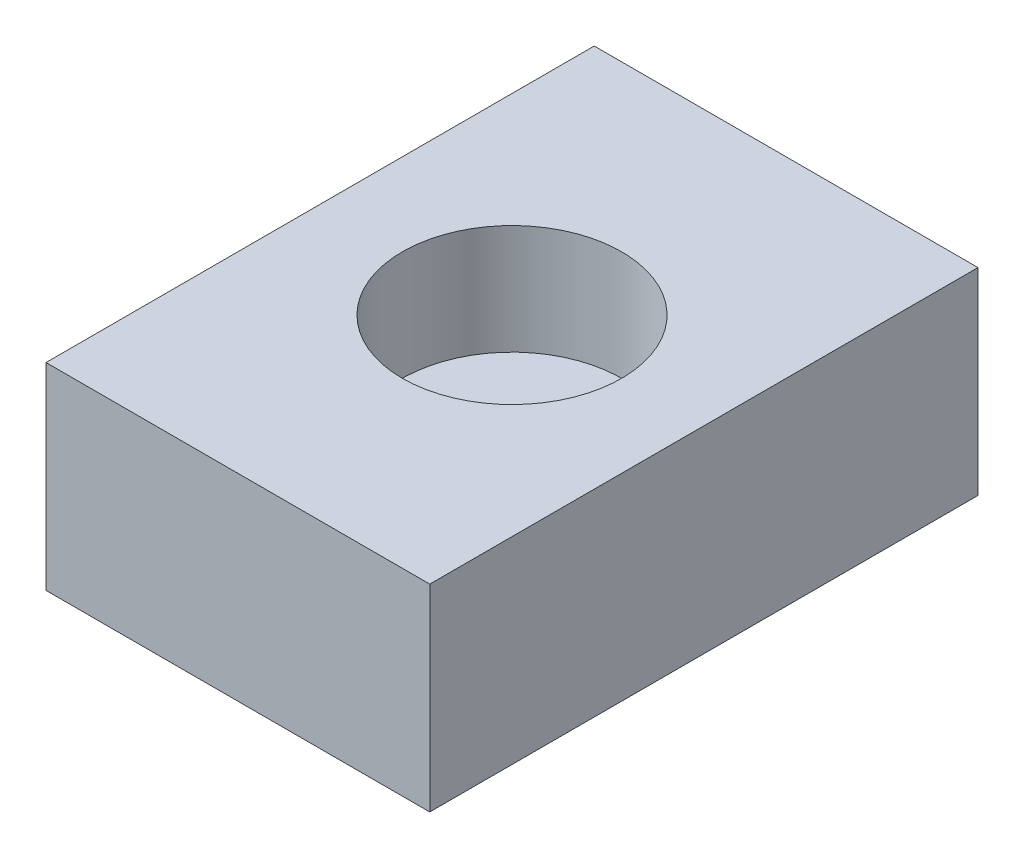
ISO-10303-21;
HEADER;
FILE_DESCRIPTION(('STEP AP214'),'2;1');
FILE_NAME('part.step','',(''),(''),'','','');
FILE_SCHEMA(('AUTOMOTIVE_DESIGN { 1 0 10303 214 1 1 1 1 }'));
ENDSEC;
DATA;
#1=APPLICATION_CONTEXT('core data for automotive mechanical design processes');
#2=APPLICATION_PROTOCOL_DEFINITION('international standard','automotive_design',2000,#1);
#3=PRODUCT_CONTEXT('',#1,'mechanical');
#4=PRODUCT('Part','Part','',(#3));
#5=PRODUCT_RELATED_PRODUCT_CATEGORY('part','',(#4));
#6=PRODUCT_DEFINITION_FORMATION('','',#4);
#7=PRODUCT_DEFINITION_CONTEXT('part definition',#1,'design');
#8=PRODUCT_DEFINITION('design','',#6,#7);
#9=PRODUCT_DEFINITION_SHAPE('','',#8);
#10=(LENGTH_UNIT() NAMED_UNIT(*) SI_UNIT(.MILLI.,.METRE.));
#11=(NAMED_UNIT(*) PLANE_ANGLE_UNIT() SI_UNIT($,.RADIAN.));
#12=(NAMED_UNIT(*) SI_UNIT($,.STERADIAN.) SOLID_ANGLE_UNIT());
#13=UNCERTAINTY_MEASURE_WITH_UNIT(LENGTH_MEASURE(1.E-05),#10,'distance_accuracy_value','');
#14=(GEOMETRIC_REPRESENTATION_CONTEXT(3) GLOBAL_UNCERTAINTY_ASSIGNED_CONTEXT((#13)) GLOBAL_UNIT_ASSIGNED_CONTEXT((#10,
#11,#12)) REPRESENTATION_CONTEXT('',''));
#15=CARTESIAN_POINT('',(0.,0.,0.));
#16=DIRECTION('',(0.,0.,1.));
#17=DIRECTION('',(1.,0.,0.));
#18=AXIS2_PLACEMENT_3D('',#15,#16,#17);
#19=CARTESIAN_POINT('',(0.,18.,25.));
#20=DIRECTION('',(0.,0.,-1.));
#21=DIRECTION('',(-1.,0.,0.));
#22=AXIS2_PLACEMENT_3D('',#19,#20,#21);
#23=PLANE('',#22);
#24=DIRECTION('',(1.,0.,0.));
#25=VECTOR('',#24,1.);
#26=CARTESIAN_POINT('',(0.,0.,25.));
#27=LINE('',#26,#25);
#28=CARTESIAN_POINT('',(-17.5,0.,25.));
#29=VERTEX_POINT('',#28);
#30=CARTESIAN_POINT('',(17.5,0.,25.));
#31=VERTEX_POINT('',#30);
#32=EDGE_CURVE('E111',#29,#31,#27,.T.);
#33=ORIENTED_EDGE('',*,*,#32,.T.);
#34=DIRECTION('',(0.,-1.,0.));
#35=VECTOR('',#34,1.);
#36=CARTESIAN_POINT('',(17.5,18.,25.));
#37=LINE('',#36,#35);
#38=CARTESIAN_POINT('',(17.5,18.,25.));
#39=VERTEX_POINT('',#38);
#40=EDGE_CURVE('E11',#39,#31,#37,.T.);
#41=ORIENTED_EDGE('',*,*,#40,.F.);
#42=DIRECTION('',(1.,0.,0.));
#43=VECTOR('',#42,1.);
#44=CARTESIAN_POINT('',(0.,18.,25.));
#45=LINE('',#44,#43);
#46=CARTESIAN_POINT('',(-17.5,18.,25.));
#47=VERTEX_POINT('',#46);
#48=EDGE_CURVE('E92',#47,#39,#45,.T.);
#49=ORIENTED_EDGE('',*,*,#48,.F.);
#50=DIRECTION('',(0.,-1.,0.));
#51=VECTOR('',#50,1.);
#52=CARTESIAN_POINT('',(-17.5,18.,25.));
#53=LINE('',#52,#51);
#54=EDGE_CURVE('E59',#47,#29,#53,.T.);
#55=ORIENTED_EDGE('',*,*,#54,.T.);
#56=EDGE_LOOP('',(#33,#41,#49,#55));
#57=FACE_BOUND('',#56,.T.);
#58=ADVANCED_FACE('F42',(#57),#23,.F.);
#59=CARTESIAN_POINT('',(17.5,18.,0.));
#60=DIRECTION('',(-1.,0.,0.));
#61=DIRECTION('',(0.,0.,1.));
#62=AXIS2_PLACEMENT_3D('',#59,#60,#61);
#63=PLANE('',#62);
#64=DIRECTION('',(0.,0.,-1.));
#65=VECTOR('',#64,1.);
#66=CARTESIAN_POINT('',(17.5,0.,0.));
#67=LINE('',#66,#65);
#68=CARTESIAN_POINT('',(17.5,0.,-25.));
#69=VERTEX_POINT('',#68);
#70=EDGE_CURVE('E98',#31,#69,#67,.T.);
#71=ORIENTED_EDGE('',*,*,#70,.T.);
#72=DIRECTION('',(0.,-1.,0.));
#73=VECTOR('',#72,1.);
#74=CARTESIAN_POINT('',(17.5,18.,-25.));
#75=LINE('',#74,#73);
#76=CARTESIAN_POINT('',(17.5,18.,-25.));
#77=VERTEX_POINT('',#76);
#78=EDGE_CURVE('E51',#77,#69,#75,.T.);
#79=ORIENTED_EDGE('',*,*,#78,.F.);
#80=DIRECTION('',(0.,0.,-1.));
#81=VECTOR('',#80,1.);
#82=CARTESIAN_POINT('',(17.5,18.,0.));
#83=LINE('',#82,#81);
#84=EDGE_CURVE('E84',#39,#77,#83,.T.);
#85=ORIENTED_EDGE('',*,*,#84,.F.);
#86=ORIENTED_EDGE('',*,*,#40,.T.);
#87=EDGE_LOOP('',(#71,#79,#85,#86));
#88=FACE_BOUND('',#87,.T.);
#89=ADVANCED_FACE('F97',(#88),#63,.F.);
#90=CARTESIAN_POINT('',(0.,18.,-25.));
#91=DIRECTION('',(0.,0.,-1.));
#92=DIRECTION('',(-1.,0.,0.));
#93=AXIS2_PLACEMENT_3D('',#90,#91,#92);
#94=PLANE('',#93);
#95=DIRECTION('',(1.,0.,0.));
#96=VECTOR('',#95,1.);
#97=CARTESIAN_POINT('',(0.,0.,-25.));
#98=LINE('',#97,#96);
#99=CARTESIAN_POINT('',(-17.5,0.,-25.));
#100=VERTEX_POINT('',#99);
#101=EDGE_CURVE('E117',#100,#69,#98,.T.);
#102=ORIENTED_EDGE('',*,*,#101,.F.);
#103=DIRECTION('',(0.,-1.,0.));
#104=VECTOR('',#103,1.);
#105=CARTESIAN_POINT('',(-17.5,18.,-25.));
#106=LINE('',#105,#104);
#107=CARTESIAN_POINT('',(-17.5,18.,-25.));
#108=VERTEX_POINT('',#107);
#109=EDGE_CURVE('E73',#108,#100,#106,.T.);
#110=ORIENTED_EDGE('',*,*,#109,.F.);
#111=DIRECTION('',(1.,0.,0.));
#112=VECTOR('',#111,1.);
#113=CARTESIAN_POINT('',(0.,18.,-25.));
#114=LINE('',#113,#112);
#115=EDGE_CURVE('E91',#108,#77,#114,.T.);
#116=ORIENTED_EDGE('',*,*,#115,.T.);
#117=ORIENTED_EDGE('',*,*,#78,.T.);
#118=EDGE_LOOP('',(#102,#110,#116,#117));
#119=FACE_BOUND('',#118,.T.);
#120=ADVANCED_FACE('F102',(#119),#94,.T.);
#121=CARTESIAN_POINT('',(-17.5,18.,0.));
#122=DIRECTION('',(-1.,0.,0.));
#123=DIRECTION('',(0.,0.,1.));
#124=AXIS2_PLACEMENT_3D('',#121,#122,#123);
#125=PLANE('',#124);
#126=DIRECTION('',(0.,0.,-1.));
#127=VECTOR('',#126,1.);
#128=CARTESIAN_POINT('',(-17.5,0.,0.));
#129=LINE('',#128,#127);
#130=EDGE_CURVE('E120',#29,#100,#129,.T.);
#131=ORIENTED_EDGE('',*,*,#130,.F.);
#132=ORIENTED_EDGE('',*,*,#54,.F.);
#133=DIRECTION('',(0.,0.,-1.));
#134=VECTOR('',#133,1.);
#135=CARTESIAN_POINT('',(-17.5,18.,0.));
#136=LINE('',#135,#134);
#137=EDGE_CURVE('E104',#47,#108,#136,.T.);
#138=ORIENTED_EDGE('',*,*,#137,.T.);
#139=ORIENTED_EDGE('',*,*,#109,.T.);
#140=EDGE_LOOP('',(#131,#132,#138,#139));
#141=FACE_BOUND('',#140,.T.);
#142=ADVANCED_FACE('F146',(#141),#125,.T.);
#143=CARTESIAN_POINT('',(0.,18.,0.));
#144=DIRECTION('',(0.,1.,0.));
#145=DIRECTION('',(0.,0.,1.));
#146=AXIS2_PLACEMENT_3D('',#143,#144,#145);
#147=PLANE('',#146);
#148=CARTESIAN_POINT('',(0.,18.,0.));
#149=DIRECTION('',(0.,1.,0.));
#150=DIRECTION('',(0.,0.,1.));
#151=AXIS2_PLACEMENT_3D('',#148,#149,#150);
#152=CIRCLE('',#151,10.);
#153=CARTESIAN_POINT('',(0.,18.,10.));
#154=VERTEX_POINT('',#153);
#155=EDGE_CURVE('E127',#154,#154,#152,.T.);
#156=ORIENTED_EDGE('',*,*,#155,.F.);
#157=EDGE_LOOP('',(#156));
#158=FACE_BOUND('',#157,.T.);
#159=ORIENTED_EDGE('',*,*,#48,.T.);
#160=ORIENTED_EDGE('',*,*,#84,.T.);
#161=ORIENTED_EDGE('',*,*,#115,.F.);
#162=ORIENTED_EDGE('',*,*,#137,.F.);
#163=EDGE_LOOP('',(#159,#160,#161,#162));
#164=FACE_BOUND('',#163,.T.);
#165=ADVANCED_FACE('F88',(#158,#164),#147,.T.);
#166=CARTESIAN_POINT('',(0.,0.,0.));
#167=DIRECTION('',(0.,1.,0.));
#168=DIRECTION('',(0.,0.,1.));
#169=AXIS2_PLACEMENT_3D('',#166,#167,#168);
#170=PLANE('',#169);
#171=ORIENTED_EDGE('',*,*,#32,.F.);
#172=ORIENTED_EDGE('',*,*,#130,.T.);
#173=ORIENTED_EDGE('',*,*,#101,.T.);
#174=ORIENTED_EDGE('',*,*,#70,.F.);
#175=EDGE_LOOP('',(#171,#172,#173,#174));
#176=FACE_BOUND('',#175,.T.);
#177=ADVANCED_FACE('F141',(#176),#170,.F.);
#178=CARTESIAN_POINT('',(0.,8.,0.));
#179=DIRECTION('',(0.,1.,0.));
#180=DIRECTION('',(0.,0.,1.));
#181=AXIS2_PLACEMENT_3D('',#178,#179,#180);
#182=CYLINDRICAL_SURFACE('',#181,10.);
#183=CARTESIAN_POINT('',(0.,8.,0.));
#184=DIRECTION('',(0.,1.,0.));
#185=DIRECTION('',(0.,0.,1.));
#186=AXIS2_PLACEMENT_3D('',#183,#184,#185);
#187=CIRCLE('',#186,10.);
#188=CARTESIAN_POINT('',(0.,8.,10.));
#189=VERTEX_POINT('',#188);
#190=EDGE_CURVE('E114',#189,#189,#187,.T.);
#191=ORIENTED_EDGE('',*,*,#190,.F.);
#192=EDGE_LOOP('',(#191));
#193=FACE_BOUND('',#192,.T.);
#194=ORIENTED_EDGE('',*,*,#155,.T.);
#195=EDGE_LOOP('',(#194));
#196=FACE_BOUND('',#195,.T.);
#197=ADVANCED_FACE('F138',(#193,#196),#182,.F.);
#198=CARTESIAN_POINT('',(0.,8.,0.));
#199=DIRECTION('',(0.,1.,0.));
#200=DIRECTION('',(0.,0.,1.));
#201=AXIS2_PLACEMENT_3D('',#198,#199,#200);
#202=PLANE('',#201);
#203=ORIENTED_EDGE('',*,*,#190,.T.);
#204=EDGE_LOOP('',(#203));
#205=FACE_BOUND('',#204,.T.);
#206=ADVANCED_FACE('F136',(#205),#202,.T.);
#207=CLOSED_SHELL('',(#58,#89,#120,#142,#165,#177,#197,#206));
#208=MANIFOLD_SOLID_BREP('B2',#207);
#209=ADVANCED_BREP_SHAPE_REPRESENTATION('',(#18,#208),#14);
#210=SHAPE_DEFINITION_REPRESENTATION(#9,#209);
ENDSEC;
END-ISO-10303-21;
